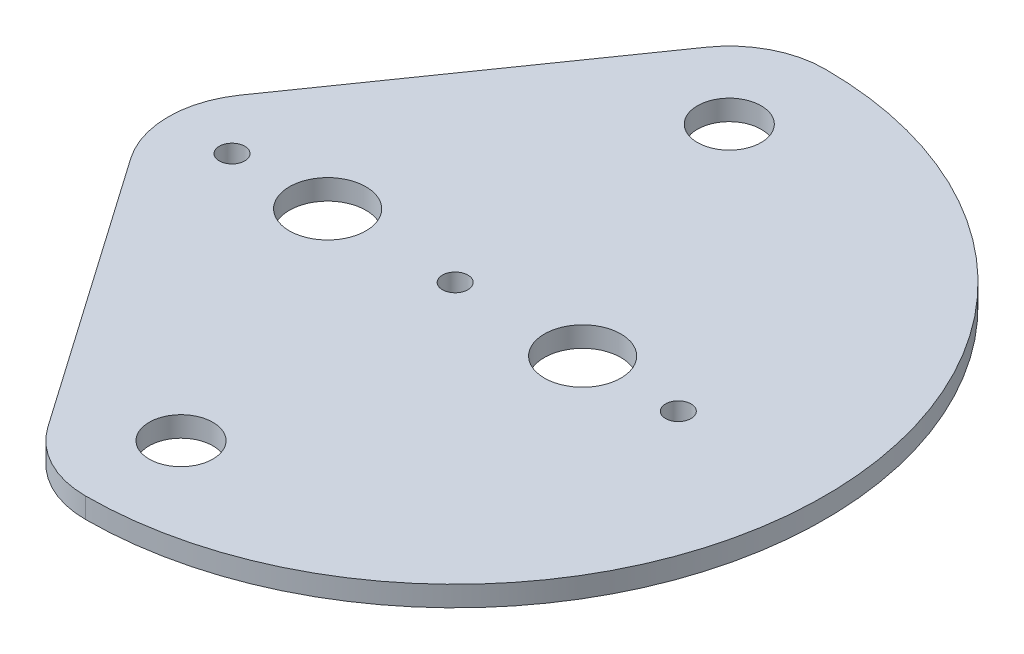
ISO-10303-21;
HEADER;
FILE_DESCRIPTION(('STEP AP214'),'2;1');
FILE_NAME('part.step','',(''),(''),'','','');
FILE_SCHEMA(('AUTOMOTIVE_DESIGN { 1 0 10303 214 1 1 1 1 }'));
ENDSEC;
DATA;
#1=APPLICATION_CONTEXT('core data for automotive mechanical design processes');
#2=APPLICATION_PROTOCOL_DEFINITION('international standard','automotive_design',2000,#1);
#3=PRODUCT_CONTEXT('',#1,'mechanical');
#4=PRODUCT('Part','Part','',(#3));
#5=PRODUCT_RELATED_PRODUCT_CATEGORY('part','',(#4));
#6=PRODUCT_DEFINITION_FORMATION('','',#4);
#7=PRODUCT_DEFINITION_CONTEXT('part definition',#1,'design');
#8=PRODUCT_DEFINITION('design','',#6,#7);
#9=PRODUCT_DEFINITION_SHAPE('','',#8);
#10=(LENGTH_UNIT() NAMED_UNIT(*) SI_UNIT(.MILLI.,.METRE.));
#11=(NAMED_UNIT(*) PLANE_ANGLE_UNIT() SI_UNIT($,.RADIAN.));
#12=(NAMED_UNIT(*) SI_UNIT($,.STERADIAN.) SOLID_ANGLE_UNIT());
#13=UNCERTAINTY_MEASURE_WITH_UNIT(LENGTH_MEASURE(1.E-05),#10,'distance_accuracy_value','');
#14=(GEOMETRIC_REPRESENTATION_CONTEXT(3) GLOBAL_UNCERTAINTY_ASSIGNED_CONTEXT((#13)) GLOBAL_UNIT_ASSIGNED_CONTEXT((#10,
#11,#12)) REPRESENTATION_CONTEXT('',''));
#15=CARTESIAN_POINT('',(0.,0.,0.));
#16=DIRECTION('',(0.,0.,1.));
#17=DIRECTION('',(1.,0.,0.));
#18=AXIS2_PLACEMENT_3D('',#15,#16,#17);
#19=CARTESIAN_POINT('',(0.,0.8,21.5));
#20=DIRECTION('',(0.,-1.,0.));
#21=DIRECTION('',(0.,0.,-1.));
#22=AXIS2_PLACEMENT_3D('',#19,#20,#21);
#23=PLANE('',#22);
#24=CARTESIAN_POINT('',(0.,0.8,21.5));
#25=DIRECTION('',(0.,1.,0.));
#26=DIRECTION('',(0.,0.,-1.));
#27=AXIS2_PLACEMENT_3D('',#24,#25,#26);
#28=CIRCLE('',#27,7.5);
#29=CARTESIAN_POINT('',(-6.15095215725888,0.8,25.7913619701806));
#30=VERTEX_POINT('',#29);
#31=CARTESIAN_POINT('',(0.,0.8,29.));
#32=VERTEX_POINT('',#31);
#33=EDGE_CURVE('E122',#30,#32,#28,.T.);
#34=ORIENTED_EDGE('',*,*,#33,.T.);
#35=CARTESIAN_POINT('',(0.,0.8,0.));
#36=DIRECTION('',(0.,1.,0.));
#37=DIRECTION('',(0.,0.,-1.));
#38=AXIS2_PLACEMENT_3D('',#35,#36,#37);
#39=CIRCLE('',#38,29.);
#40=CARTESIAN_POINT('',(0.,0.8,-29.));
#41=VERTEX_POINT('',#40);
#42=EDGE_CURVE('E48',#32,#41,#39,.T.);
#43=ORIENTED_EDGE('',*,*,#42,.T.);
#44=CARTESIAN_POINT('',(0.,0.8,-21.5));
#45=DIRECTION('',(0.,1.,0.));
#46=DIRECTION('',(0.,0.,-1.));
#47=AXIS2_PLACEMENT_3D('',#44,#45,#46);
#48=CIRCLE('',#47,7.5);
#49=CARTESIAN_POINT('',(-6.15095215725888,0.8,-25.7913619701806));
#50=VERTEX_POINT('',#49);
#51=EDGE_CURVE('E81',#41,#50,#48,.T.);
#52=ORIENTED_EDGE('',*,*,#51,.T.);
#53=DIRECTION('',(-0.572181596024081,0.,0.820126954301183));
#54=VECTOR('',#53,1.);
#55=CARTESIAN_POINT('',(-21.1509521572589,0.8,-4.29136197018061));
#56=LINE('',#55,#54);
#57=CARTESIAN_POINT('',(-21.1509521572589,0.8,-4.29136197018061));
#58=VERTEX_POINT('',#57);
#59=EDGE_CURVE('E138',#50,#58,#56,.T.);
#60=ORIENTED_EDGE('',*,*,#59,.T.);
#61=CARTESIAN_POINT('',(-15.,0.8,0.));
#62=DIRECTION('',(0.,1.,0.));
#63=DIRECTION('',(0.,0.,-1.));
#64=AXIS2_PLACEMENT_3D('',#61,#62,#63);
#65=CIRCLE('',#64,7.5);
#66=CARTESIAN_POINT('',(-21.1509521572589,0.8,4.29136197018061));
#67=VERTEX_POINT('',#66);
#68=EDGE_CURVE('E132',#58,#67,#65,.T.);
#69=ORIENTED_EDGE('',*,*,#68,.T.);
#70=DIRECTION('',(0.572181596024081,0.,0.820126954301183));
#71=VECTOR('',#70,1.);
#72=CARTESIAN_POINT('',(-6.15095215725888,0.8,25.7913619701806));
#73=LINE('',#72,#71);
#74=EDGE_CURVE('E55',#67,#30,#73,.T.);
#75=ORIENTED_EDGE('',*,*,#74,.T.);
#76=EDGE_LOOP('',(#34,#43,#52,#60,#69,#75));
#77=FACE_BOUND('',#76,.T.);
#78=CARTESIAN_POINT('',(0.,0.8,-21.5));
#79=DIRECTION('',(0.,1.,0.));
#80=DIRECTION('',(0.,0.,1.));
#81=AXIS2_PLACEMENT_3D('',#78,#79,#80);
#82=CIRCLE('',#81,2.5);
#83=CARTESIAN_POINT('',(0.,0.8,-19.));
#84=VERTEX_POINT('',#83);
#85=EDGE_CURVE('E116',#84,#84,#82,.T.);
#86=ORIENTED_EDGE('',*,*,#85,.F.);
#87=EDGE_LOOP('',(#86));
#88=FACE_BOUND('',#87,.T.);
#89=CARTESIAN_POINT('',(0.,0.8,21.5));
#90=DIRECTION('',(0.,1.,0.));
#91=DIRECTION('',(0.,0.,1.));
#92=AXIS2_PLACEMENT_3D('',#89,#90,#91);
#93=CIRCLE('',#92,2.5);
#94=CARTESIAN_POINT('',(0.,0.8,24.));
#95=VERTEX_POINT('',#94);
#96=EDGE_CURVE('E147',#95,#95,#93,.T.);
#97=ORIENTED_EDGE('',*,*,#96,.F.);
#98=EDGE_LOOP('',(#97));
#99=FACE_BOUND('',#98,.T.);
#100=CARTESIAN_POINT('',(-10.,0.8,0.));
#101=DIRECTION('',(0.,1.,0.));
#102=DIRECTION('',(0.,0.,1.));
#103=AXIS2_PLACEMENT_3D('',#100,#101,#102);
#104=CIRCLE('',#103,3.);
#105=CARTESIAN_POINT('',(-10.,0.8,3.));
#106=VERTEX_POINT('',#105);
#107=EDGE_CURVE('E153',#106,#106,#104,.T.);
#108=ORIENTED_EDGE('',*,*,#107,.F.);
#109=EDGE_LOOP('',(#108));
#110=FACE_BOUND('',#109,.T.);
#111=CARTESIAN_POINT('',(10.,0.8,0.));
#112=DIRECTION('',(0.,1.,0.));
#113=DIRECTION('',(0.,0.,1.));
#114=AXIS2_PLACEMENT_3D('',#111,#112,#113);
#115=CIRCLE('',#114,3.);
#116=CARTESIAN_POINT('',(10.,0.8,3.));
#117=VERTEX_POINT('',#116);
#118=EDGE_CURVE('E159',#117,#117,#115,.T.);
#119=ORIENTED_EDGE('',*,*,#118,.F.);
#120=EDGE_LOOP('',(#119));
#121=FACE_BOUND('',#120,.T.);
#122=CARTESIAN_POINT('',(-17.5,0.8,0.));
#123=DIRECTION('',(0.,1.,0.));
#124=DIRECTION('',(0.,0.,1.));
#125=AXIS2_PLACEMENT_3D('',#122,#123,#124);
#126=CIRCLE('',#125,1.);
#127=CARTESIAN_POINT('',(-17.5,0.8,1.));
#128=VERTEX_POINT('',#127);
#129=EDGE_CURVE('E165',#128,#128,#126,.T.);
#130=ORIENTED_EDGE('',*,*,#129,.F.);
#131=EDGE_LOOP('',(#130));
#132=FACE_BOUND('',#131,.T.);
#133=CARTESIAN_POINT('',(0.,0.8,0.));
#134=DIRECTION('',(0.,1.,0.));
#135=DIRECTION('',(0.,0.,1.));
#136=AXIS2_PLACEMENT_3D('',#133,#134,#135);
#137=CIRCLE('',#136,1.);
#138=CARTESIAN_POINT('',(0.,0.8,1.));
#139=VERTEX_POINT('',#138);
#140=EDGE_CURVE('E171',#139,#139,#137,.T.);
#141=ORIENTED_EDGE('',*,*,#140,.F.);
#142=EDGE_LOOP('',(#141));
#143=FACE_BOUND('',#142,.T.);
#144=CARTESIAN_POINT('',(17.5,0.8,0.));
#145=DIRECTION('',(0.,1.,0.));
#146=DIRECTION('',(0.,0.,1.));
#147=AXIS2_PLACEMENT_3D('',#144,#145,#146);
#148=CIRCLE('',#147,1.);
#149=CARTESIAN_POINT('',(17.5,0.8,1.));
#150=VERTEX_POINT('',#149);
#151=EDGE_CURVE('E177',#150,#150,#148,.T.);
#152=ORIENTED_EDGE('',*,*,#151,.F.);
#153=EDGE_LOOP('',(#152));
#154=FACE_BOUND('',#153,.T.);
#155=ADVANCED_FACE('F33',(#77,#88,#99,#110,#121,#132,#143,#154),#23,.F.);
#156=CARTESIAN_POINT('',(0.,-0.8,21.5));
#157=DIRECTION('',(0.,-1.,0.));
#158=DIRECTION('',(0.,0.,-1.));
#159=AXIS2_PLACEMENT_3D('',#156,#157,#158);
#160=PLANE('',#159);
#161=CARTESIAN_POINT('',(0.,-0.8,0.));
#162=DIRECTION('',(0.,1.,0.));
#163=DIRECTION('',(0.,0.,-1.));
#164=AXIS2_PLACEMENT_3D('',#161,#162,#163);
#165=CIRCLE('',#164,29.);
#166=CARTESIAN_POINT('',(0.,-0.8,29.));
#167=VERTEX_POINT('',#166);
#168=CARTESIAN_POINT('',(0.,-0.8,-29.));
#169=VERTEX_POINT('',#168);
#170=EDGE_CURVE('E92',#167,#169,#165,.T.);
#171=ORIENTED_EDGE('',*,*,#170,.F.);
#172=CARTESIAN_POINT('',(0.,-0.8,21.5));
#173=DIRECTION('',(0.,1.,0.));
#174=DIRECTION('',(0.,0.,-1.));
#175=AXIS2_PLACEMENT_3D('',#172,#173,#174);
#176=CIRCLE('',#175,7.5);
#177=CARTESIAN_POINT('',(-6.15095215725888,-0.8,25.7913619701806));
#178=VERTEX_POINT('',#177);
#179=EDGE_CURVE('E112',#178,#167,#176,.T.);
#180=ORIENTED_EDGE('',*,*,#179,.F.);
#181=DIRECTION('',(0.572181596024081,0.,0.820126954301183));
#182=VECTOR('',#181,1.);
#183=CARTESIAN_POINT('',(-6.15095215725888,-0.8,25.7913619701806));
#184=LINE('',#183,#182);
#185=CARTESIAN_POINT('',(-21.1509521572589,-0.8,4.29136197018061));
#186=VERTEX_POINT('',#185);
#187=EDGE_CURVE('E76',#186,#178,#184,.T.);
#188=ORIENTED_EDGE('',*,*,#187,.F.);
#189=CARTESIAN_POINT('',(-15.,-0.8,0.));
#190=DIRECTION('',(0.,1.,0.));
#191=DIRECTION('',(0.,0.,-1.));
#192=AXIS2_PLACEMENT_3D('',#189,#190,#191);
#193=CIRCLE('',#192,7.5);
#194=CARTESIAN_POINT('',(-21.1509521572589,-0.8,-4.29136197018061));
#195=VERTEX_POINT('',#194);
#196=EDGE_CURVE('E114',#195,#186,#193,.T.);
#197=ORIENTED_EDGE('',*,*,#196,.F.);
#198=DIRECTION('',(-0.572181596024081,0.,0.820126954301183));
#199=VECTOR('',#198,1.);
#200=CARTESIAN_POINT('',(-21.1509521572589,-0.8,-4.29136197018061));
#201=LINE('',#200,#199);
#202=CARTESIAN_POINT('',(-6.15095215725888,-0.8,-25.7913619701806));
#203=VERTEX_POINT('',#202);
#204=EDGE_CURVE('E111',#203,#195,#201,.T.);
#205=ORIENTED_EDGE('',*,*,#204,.F.);
#206=CARTESIAN_POINT('',(0.,-0.8,-21.5));
#207=DIRECTION('',(0.,1.,0.));
#208=DIRECTION('',(0.,0.,-1.));
#209=AXIS2_PLACEMENT_3D('',#206,#207,#208);
#210=CIRCLE('',#209,7.5);
#211=EDGE_CURVE('E105',#169,#203,#210,.T.);
#212=ORIENTED_EDGE('',*,*,#211,.F.);
#213=EDGE_LOOP('',(#171,#180,#188,#197,#205,#212));
#214=FACE_BOUND('',#213,.T.);
#215=CARTESIAN_POINT('',(0.,-0.8,0.));
#216=DIRECTION('',(0.,1.,0.));
#217=DIRECTION('',(0.,0.,1.));
#218=AXIS2_PLACEMENT_3D('',#215,#216,#217);
#219=CIRCLE('',#218,1.);
#220=CARTESIAN_POINT('',(0.,-0.8,1.));
#221=VERTEX_POINT('',#220);
#222=EDGE_CURVE('E174',#221,#221,#219,.T.);
#223=ORIENTED_EDGE('',*,*,#222,.T.);
#224=EDGE_LOOP('',(#223));
#225=FACE_BOUND('',#224,.T.);
#226=CARTESIAN_POINT('',(10.,-0.8,0.));
#227=DIRECTION('',(0.,1.,0.));
#228=DIRECTION('',(0.,0.,1.));
#229=AXIS2_PLACEMENT_3D('',#226,#227,#228);
#230=CIRCLE('',#229,3.);
#231=CARTESIAN_POINT('',(10.,-0.8,3.));
#232=VERTEX_POINT('',#231);
#233=EDGE_CURVE('E162',#232,#232,#230,.T.);
#234=ORIENTED_EDGE('',*,*,#233,.T.);
#235=EDGE_LOOP('',(#234));
#236=FACE_BOUND('',#235,.T.);
#237=CARTESIAN_POINT('',(0.,-0.8,21.5));
#238=DIRECTION('',(0.,1.,0.));
#239=DIRECTION('',(0.,0.,1.));
#240=AXIS2_PLACEMENT_3D('',#237,#238,#239);
#241=CIRCLE('',#240,2.5);
#242=CARTESIAN_POINT('',(0.,-0.8,24.));
#243=VERTEX_POINT('',#242);
#244=EDGE_CURVE('E150',#243,#243,#241,.T.);
#245=ORIENTED_EDGE('',*,*,#244,.T.);
#246=EDGE_LOOP('',(#245));
#247=FACE_BOUND('',#246,.T.);
#248=CARTESIAN_POINT('',(0.,-0.8,-21.5));
#249=DIRECTION('',(0.,1.,0.));
#250=DIRECTION('',(0.,0.,1.));
#251=AXIS2_PLACEMENT_3D('',#248,#249,#250);
#252=CIRCLE('',#251,2.5);
#253=CARTESIAN_POINT('',(0.,-0.8,-19.));
#254=VERTEX_POINT('',#253);
#255=EDGE_CURVE('E144',#254,#254,#252,.T.);
#256=ORIENTED_EDGE('',*,*,#255,.T.);
#257=EDGE_LOOP('',(#256));
#258=FACE_BOUND('',#257,.T.);
#259=CARTESIAN_POINT('',(-10.,-0.8,0.));
#260=DIRECTION('',(0.,1.,0.));
#261=DIRECTION('',(0.,0.,1.));
#262=AXIS2_PLACEMENT_3D('',#259,#260,#261);
#263=CIRCLE('',#262,3.);
#264=CARTESIAN_POINT('',(-10.,-0.8,3.));
#265=VERTEX_POINT('',#264);
#266=EDGE_CURVE('E156',#265,#265,#263,.T.);
#267=ORIENTED_EDGE('',*,*,#266,.T.);
#268=EDGE_LOOP('',(#267));
#269=FACE_BOUND('',#268,.T.);
#270=CARTESIAN_POINT('',(-17.5,-0.8,0.));
#271=DIRECTION('',(0.,1.,0.));
#272=DIRECTION('',(0.,0.,1.));
#273=AXIS2_PLACEMENT_3D('',#270,#271,#272);
#274=CIRCLE('',#273,1.);
#275=CARTESIAN_POINT('',(-17.5,-0.8,1.));
#276=VERTEX_POINT('',#275);
#277=EDGE_CURVE('E168',#276,#276,#274,.T.);
#278=ORIENTED_EDGE('',*,*,#277,.T.);
#279=EDGE_LOOP('',(#278));
#280=FACE_BOUND('',#279,.T.);
#281=CARTESIAN_POINT('',(17.5,-0.8,0.));
#282=DIRECTION('',(0.,1.,0.));
#283=DIRECTION('',(0.,0.,1.));
#284=AXIS2_PLACEMENT_3D('',#281,#282,#283);
#285=CIRCLE('',#284,1.);
#286=CARTESIAN_POINT('',(17.5,-0.8,1.));
#287=VERTEX_POINT('',#286);
#288=EDGE_CURVE('E180',#287,#287,#285,.T.);
#289=ORIENTED_EDGE('',*,*,#288,.T.);
#290=EDGE_LOOP('',(#289));
#291=FACE_BOUND('',#290,.T.);
#292=ADVANCED_FACE('F108',(#214,#225,#236,#247,#258,#269,#280,#291),#160,.T.);
#293=CARTESIAN_POINT('',(0.,0.8,21.5));
#294=DIRECTION('',(0.,-1.,0.));
#295=DIRECTION('',(0.,0.,-1.));
#296=AXIS2_PLACEMENT_3D('',#293,#294,#295);
#297=CYLINDRICAL_SURFACE('',#296,7.5);
#298=ORIENTED_EDGE('',*,*,#179,.T.);
#299=DIRECTION('',(0.,1.,0.));
#300=VECTOR('',#299,1.);
#301=CARTESIAN_POINT('',(0.,-0.8,29.));
#302=LINE('',#301,#300);
#303=EDGE_CURVE('E97',#167,#32,#302,.T.);
#304=ORIENTED_EDGE('',*,*,#303,.T.);
#305=ORIENTED_EDGE('',*,*,#33,.F.);
#306=DIRECTION('',(0.,-1.,0.));
#307=VECTOR('',#306,1.);
#308=CARTESIAN_POINT('',(-6.15095215725888,0.8,25.7913619701806));
#309=LINE('',#308,#307);
#310=EDGE_CURVE('E123',#30,#178,#309,.T.);
#311=ORIENTED_EDGE('',*,*,#310,.T.);
#312=EDGE_LOOP('',(#298,#304,#305,#311));
#313=FACE_BOUND('',#312,.T.);
#314=ADVANCED_FACE('F35',(#313),#297,.T.);
#315=CARTESIAN_POINT('',(0.,0.8,-21.5));
#316=DIRECTION('',(0.,-1.,0.));
#317=DIRECTION('',(0.,0.,-1.));
#318=AXIS2_PLACEMENT_3D('',#315,#316,#317);
#319=CYLINDRICAL_SURFACE('',#318,7.5);
#320=ORIENTED_EDGE('',*,*,#51,.F.);
#321=DIRECTION('',(0.,1.,0.));
#322=VECTOR('',#321,1.);
#323=CARTESIAN_POINT('',(0.,-0.8,-29.));
#324=LINE('',#323,#322);
#325=EDGE_CURVE('E95',#169,#41,#324,.T.);
#326=ORIENTED_EDGE('',*,*,#325,.F.);
#327=ORIENTED_EDGE('',*,*,#211,.T.);
#328=DIRECTION('',(0.,-1.,0.));
#329=VECTOR('',#328,1.);
#330=CARTESIAN_POINT('',(-6.15095215725888,0.8,-25.7913619701806));
#331=LINE('',#330,#329);
#332=EDGE_CURVE('E11',#50,#203,#331,.T.);
#333=ORIENTED_EDGE('',*,*,#332,.F.);
#334=EDGE_LOOP('',(#320,#326,#327,#333));
#335=FACE_BOUND('',#334,.T.);
#336=ADVANCED_FACE('F104',(#335),#319,.T.);
#337=CARTESIAN_POINT('',(-21.1509521572589,0.8,-4.29136197018061));
#338=DIRECTION('',(0.820126954301183,0.,0.572181596024081));
#339=DIRECTION('',(0.572181596024081,0.,-0.820126954301183));
#340=AXIS2_PLACEMENT_3D('',#337,#338,#339);
#341=PLANE('',#340);
#342=ORIENTED_EDGE('',*,*,#204,.T.);
#343=DIRECTION('',(0.,-1.,0.));
#344=VECTOR('',#343,1.);
#345=CARTESIAN_POINT('',(-21.1509521572589,0.8,-4.29136197018061));
#346=LINE('',#345,#344);
#347=EDGE_CURVE('E41',#58,#195,#346,.T.);
#348=ORIENTED_EDGE('',*,*,#347,.F.);
#349=ORIENTED_EDGE('',*,*,#59,.F.);
#350=ORIENTED_EDGE('',*,*,#332,.T.);
#351=EDGE_LOOP('',(#342,#348,#349,#350));
#352=FACE_BOUND('',#351,.T.);
#353=ADVANCED_FACE('F207',(#352),#341,.F.);
#354=CARTESIAN_POINT('',(-15.,0.8,0.));
#355=DIRECTION('',(0.,-1.,0.));
#356=DIRECTION('',(0.,0.,-1.));
#357=AXIS2_PLACEMENT_3D('',#354,#355,#356);
#358=CYLINDRICAL_SURFACE('',#357,7.5);
#359=ORIENTED_EDGE('',*,*,#196,.T.);
#360=DIRECTION('',(0.,-1.,0.));
#361=VECTOR('',#360,1.);
#362=CARTESIAN_POINT('',(-21.1509521572589,0.8,4.29136197018061));
#363=LINE('',#362,#361);
#364=EDGE_CURVE('E125',#67,#186,#363,.T.);
#365=ORIENTED_EDGE('',*,*,#364,.F.);
#366=ORIENTED_EDGE('',*,*,#68,.F.);
#367=ORIENTED_EDGE('',*,*,#347,.T.);
#368=EDGE_LOOP('',(#359,#365,#366,#367));
#369=FACE_BOUND('',#368,.T.);
#370=ADVANCED_FACE('F130',(#369),#358,.T.);
#371=CARTESIAN_POINT('',(-6.15095215725888,0.8,25.7913619701806));
#372=DIRECTION('',(0.820126954301183,0.,-0.572181596024081));
#373=DIRECTION('',(-0.572181596024081,0.,-0.820126954301183));
#374=AXIS2_PLACEMENT_3D('',#371,#372,#373);
#375=PLANE('',#374);
#376=ORIENTED_EDGE('',*,*,#187,.T.);
#377=ORIENTED_EDGE('',*,*,#310,.F.);
#378=ORIENTED_EDGE('',*,*,#74,.F.);
#379=ORIENTED_EDGE('',*,*,#364,.T.);
#380=EDGE_LOOP('',(#376,#377,#378,#379));
#381=FACE_BOUND('',#380,.T.);
#382=ADVANCED_FACE('F137',(#381),#375,.F.);
#383=CARTESIAN_POINT('',(0.,0.8,-21.5));
#384=DIRECTION('',(0.,-1.,0.));
#385=DIRECTION('',(0.,0.,-1.));
#386=AXIS2_PLACEMENT_3D('',#383,#384,#385);
#387=CYLINDRICAL_SURFACE('',#386,2.5);
#388=ORIENTED_EDGE('',*,*,#85,.T.);
#389=EDGE_LOOP('',(#388));
#390=FACE_BOUND('',#389,.T.);
#391=ORIENTED_EDGE('',*,*,#255,.F.);
#392=EDGE_LOOP('',(#391));
#393=FACE_BOUND('',#392,.T.);
#394=ADVANCED_FACE('F200',(#390,#393),#387,.F.);
#395=CARTESIAN_POINT('',(0.,0.8,21.5));
#396=DIRECTION('',(0.,-1.,0.));
#397=DIRECTION('',(0.,0.,-1.));
#398=AXIS2_PLACEMENT_3D('',#395,#396,#397);
#399=CYLINDRICAL_SURFACE('',#398,2.5);
#400=ORIENTED_EDGE('',*,*,#96,.T.);
#401=EDGE_LOOP('',(#400));
#402=FACE_BOUND('',#401,.T.);
#403=ORIENTED_EDGE('',*,*,#244,.F.);
#404=EDGE_LOOP('',(#403));
#405=FACE_BOUND('',#404,.T.);
#406=ADVANCED_FACE('F275',(#402,#405),#399,.F.);
#407=CARTESIAN_POINT('',(-10.,0.8,0.));
#408=DIRECTION('',(0.,-1.,0.));
#409=DIRECTION('',(0.,0.,-1.));
#410=AXIS2_PLACEMENT_3D('',#407,#408,#409);
#411=CYLINDRICAL_SURFACE('',#410,3.);
#412=ORIENTED_EDGE('',*,*,#107,.T.);
#413=EDGE_LOOP('',(#412));
#414=FACE_BOUND('',#413,.T.);
#415=ORIENTED_EDGE('',*,*,#266,.F.);
#416=EDGE_LOOP('',(#415));
#417=FACE_BOUND('',#416,.T.);
#418=ADVANCED_FACE('F265',(#414,#417),#411,.F.);
#419=CARTESIAN_POINT('',(10.,0.8,0.));
#420=DIRECTION('',(0.,-1.,0.));
#421=DIRECTION('',(0.,0.,-1.));
#422=AXIS2_PLACEMENT_3D('',#419,#420,#421);
#423=CYLINDRICAL_SURFACE('',#422,3.);
#424=ORIENTED_EDGE('',*,*,#118,.T.);
#425=EDGE_LOOP('',(#424));
#426=FACE_BOUND('',#425,.T.);
#427=ORIENTED_EDGE('',*,*,#233,.F.);
#428=EDGE_LOOP('',(#427));
#429=FACE_BOUND('',#428,.T.);
#430=ADVANCED_FACE('F255',(#426,#429),#423,.F.);
#431=CARTESIAN_POINT('',(-17.5,0.8,0.));
#432=DIRECTION('',(0.,-1.,0.));
#433=DIRECTION('',(0.,0.,-1.));
#434=AXIS2_PLACEMENT_3D('',#431,#432,#433);
#435=CYLINDRICAL_SURFACE('',#434,1.);
#436=ORIENTED_EDGE('',*,*,#129,.T.);
#437=EDGE_LOOP('',(#436));
#438=FACE_BOUND('',#437,.T.);
#439=ORIENTED_EDGE('',*,*,#277,.F.);
#440=EDGE_LOOP('',(#439));
#441=FACE_BOUND('',#440,.T.);
#442=ADVANCED_FACE('F245',(#438,#441),#435,.F.);
#443=CARTESIAN_POINT('',(0.,0.8,0.));
#444=DIRECTION('',(0.,-1.,0.));
#445=DIRECTION('',(0.,0.,-1.));
#446=AXIS2_PLACEMENT_3D('',#443,#444,#445);
#447=CYLINDRICAL_SURFACE('',#446,1.);
#448=ORIENTED_EDGE('',*,*,#140,.T.);
#449=EDGE_LOOP('',(#448));
#450=FACE_BOUND('',#449,.T.);
#451=ORIENTED_EDGE('',*,*,#222,.F.);
#452=EDGE_LOOP('',(#451));
#453=FACE_BOUND('',#452,.T.);
#454=ADVANCED_FACE('F236',(#450,#453),#447,.F.);
#455=CARTESIAN_POINT('',(17.5,0.8,0.));
#456=DIRECTION('',(0.,-1.,0.));
#457=DIRECTION('',(0.,0.,-1.));
#458=AXIS2_PLACEMENT_3D('',#455,#456,#457);
#459=CYLINDRICAL_SURFACE('',#458,1.);
#460=ORIENTED_EDGE('',*,*,#151,.T.);
#461=EDGE_LOOP('',(#460));
#462=FACE_BOUND('',#461,.T.);
#463=ORIENTED_EDGE('',*,*,#288,.F.);
#464=EDGE_LOOP('',(#463));
#465=FACE_BOUND('',#464,.T.);
#466=ADVANCED_FACE('F188',(#462,#465),#459,.F.);
#467=CARTESIAN_POINT('',(0.,-0.8,0.));
#468=DIRECTION('',(0.,1.,0.));
#469=DIRECTION('',(0.,0.,1.));
#470=AXIS2_PLACEMENT_3D('',#467,#468,#469);
#471=CYLINDRICAL_SURFACE('',#470,29.);
#472=ORIENTED_EDGE('',*,*,#42,.F.);
#473=ORIENTED_EDGE('',*,*,#303,.F.);
#474=ORIENTED_EDGE('',*,*,#170,.T.);
#475=ORIENTED_EDGE('',*,*,#325,.T.);
#476=EDGE_LOOP('',(#472,#473,#474,#475));
#477=FACE_BOUND('',#476,.T.);
#478=ADVANCED_FACE('F94',(#477),#471,.T.);
#479=CLOSED_SHELL('',(#155,#292,#314,#336,#353,#370,#382,#394,#406,#418,#430,#442,#454,#466,#478));
#480=MANIFOLD_SOLID_BREP('B2',#479);
#481=ADVANCED_BREP_SHAPE_REPRESENTATION('',(#18,#480),#14);
#482=SHAPE_DEFINITION_REPRESENTATION(#9,#481);
ENDSEC;
END-ISO-10303-21;
